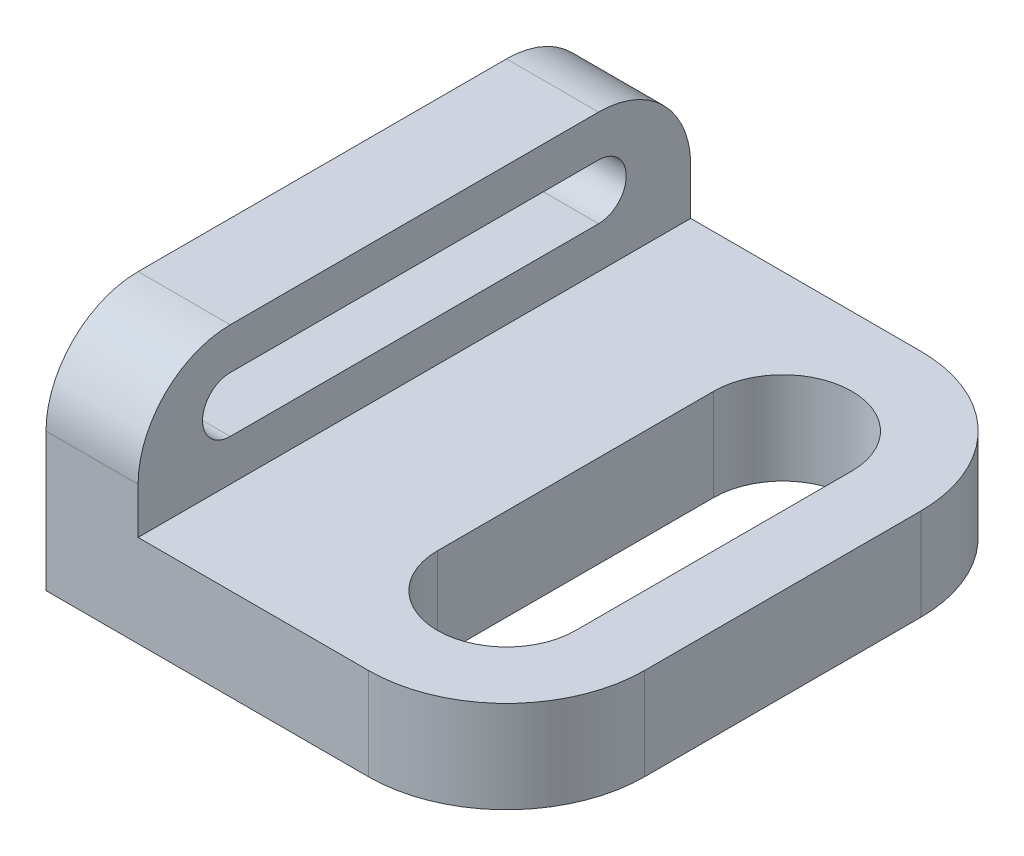
ISO-10303-21;
HEADER;
FILE_DESCRIPTION(('STEP AP214'),'2;1');
FILE_NAME('part.step','',(''),(''),'','','');
FILE_SCHEMA(('AUTOMOTIVE_DESIGN { 1 0 10303 214 1 1 1 1 }'));
ENDSEC;
DATA;
#1=APPLICATION_CONTEXT('core data for automotive mechanical design processes');
#2=APPLICATION_PROTOCOL_DEFINITION('international standard','automotive_design',2000,#1);
#3=PRODUCT_CONTEXT('',#1,'mechanical');
#4=PRODUCT('Part','Part','',(#3));
#5=PRODUCT_RELATED_PRODUCT_CATEGORY('part','',(#4));
#6=PRODUCT_DEFINITION_FORMATION('','',#4);
#7=PRODUCT_DEFINITION_CONTEXT('part definition',#1,'design');
#8=PRODUCT_DEFINITION('design','',#6,#7);
#9=PRODUCT_DEFINITION_SHAPE('','',#8);
#10=(LENGTH_UNIT() NAMED_UNIT(*) SI_UNIT(.MILLI.,.METRE.));
#11=(NAMED_UNIT(*) PLANE_ANGLE_UNIT() SI_UNIT($,.RADIAN.));
#12=(NAMED_UNIT(*) SI_UNIT($,.STERADIAN.) SOLID_ANGLE_UNIT());
#13=UNCERTAINTY_MEASURE_WITH_UNIT(LENGTH_MEASURE(1.E-05),#10,'distance_accuracy_value','');
#14=(GEOMETRIC_REPRESENTATION_CONTEXT(3) GLOBAL_UNCERTAINTY_ASSIGNED_CONTEXT((#13)) GLOBAL_UNIT_ASSIGNED_CONTEXT((#10,
#11,#12)) REPRESENTATION_CONTEXT('',''));
#15=CARTESIAN_POINT('',(0.,0.,0.));
#16=DIRECTION('',(0.,0.,1.));
#17=DIRECTION('',(1.,0.,0.));
#18=AXIS2_PLACEMENT_3D('',#15,#16,#17);
#19=CARTESIAN_POINT('',(-50.,20.,-60.));
#20=DIRECTION('',(1.,0.,0.));
#21=DIRECTION('',(0.,0.,-1.));
#22=AXIS2_PLACEMENT_3D('',#19,#20,#21);
#23=PLANE('',#22);
#24=DIRECTION('',(0.,0.,1.));
#25=VECTOR('',#24,1.);
#26=CARTESIAN_POINT('',(-50.,41.,40.));
#27=LINE('',#26,#25);
#28=CARTESIAN_POINT('',(-50.,41.,-40.));
#29=VERTEX_POINT('',#28);
#30=CARTESIAN_POINT('',(-50.,41.,40.));
#31=VERTEX_POINT('',#30);
#32=EDGE_CURVE('E385',#29,#31,#27,.T.);
#33=ORIENTED_EDGE('',*,*,#32,.T.);
#34=CARTESIAN_POINT('',(-50.,35.,40.));
#35=DIRECTION('',(1.,0.,0.));
#36=DIRECTION('',(0.,0.,-1.));
#37=AXIS2_PLACEMENT_3D('',#34,#35,#36);
#38=CIRCLE('',#37,6.);
#39=CARTESIAN_POINT('',(-50.,29.,40.));
#40=VERTEX_POINT('',#39);
#41=EDGE_CURVE('E389',#40,#31,#38,.F.);
#42=ORIENTED_EDGE('',*,*,#41,.F.);
#43=DIRECTION('',(0.,0.,1.));
#44=VECTOR('',#43,1.);
#45=CARTESIAN_POINT('',(-50.,29.,40.));
#46=LINE('',#45,#44);
#47=CARTESIAN_POINT('',(-50.,29.,-40.));
#48=VERTEX_POINT('',#47);
#49=EDGE_CURVE('E392',#48,#40,#46,.T.);
#50=ORIENTED_EDGE('',*,*,#49,.F.);
#51=CARTESIAN_POINT('',(-50.,35.,-40.));
#52=DIRECTION('',(1.,0.,0.));
#53=DIRECTION('',(0.,0.,-1.));
#54=AXIS2_PLACEMENT_3D('',#51,#52,#53);
#55=CIRCLE('',#54,6.);
#56=EDGE_CURVE('E381',#29,#48,#55,.F.);
#57=ORIENTED_EDGE('',*,*,#56,.F.);
#58=EDGE_LOOP('',(#33,#42,#50,#57));
#59=FACE_BOUND('',#58,.T.);
#60=CARTESIAN_POINT('',(-50.,30.,-40.));
#61=DIRECTION('',(1.,0.,0.));
#62=DIRECTION('',(0.,0.,-1.));
#63=AXIS2_PLACEMENT_3D('',#60,#61,#62);
#64=CIRCLE('',#63,20.);
#65=CARTESIAN_POINT('',(-50.,50.,-39.9999999999999));
#66=VERTEX_POINT('',#65);
#67=CARTESIAN_POINT('',(-50.,29.9999999999999,-60.));
#68=VERTEX_POINT('',#67);
#69=EDGE_CURVE('E210',#66,#68,#64,.F.);
#70=ORIENTED_EDGE('',*,*,#69,.T.);
#71=DIRECTION('',(0.,-1.,0.));
#72=VECTOR('',#71,1.);
#73=CARTESIAN_POINT('',(-50.,20.,-60.));
#74=LINE('',#73,#72);
#75=CARTESIAN_POINT('',(-50.,0.,-60.));
#76=VERTEX_POINT('',#75);
#77=EDGE_CURVE('E223',#68,#76,#74,.T.);
#78=ORIENTED_EDGE('',*,*,#77,.T.);
#79=DIRECTION('',(0.,0.,1.));
#80=VECTOR('',#79,1.);
#81=CARTESIAN_POINT('',(-50.,0.,-60.));
#82=LINE('',#81,#80);
#83=CARTESIAN_POINT('',(-50.,0.,60.));
#84=VERTEX_POINT('',#83);
#85=EDGE_CURVE('E281',#76,#84,#82,.T.);
#86=ORIENTED_EDGE('',*,*,#85,.T.);
#87=DIRECTION('',(0.,-1.,0.));
#88=VECTOR('',#87,1.);
#89=CARTESIAN_POINT('',(-50.,20.,60.));
#90=LINE('',#89,#88);
#91=CARTESIAN_POINT('',(-50.,29.9999999999999,60.));
#92=VERTEX_POINT('',#91);
#93=EDGE_CURVE('E12',#92,#84,#90,.T.);
#94=ORIENTED_EDGE('',*,*,#93,.F.);
#95=CARTESIAN_POINT('',(-50.,30.,40.));
#96=DIRECTION('',(1.,0.,0.));
#97=DIRECTION('',(0.,0.,-1.));
#98=AXIS2_PLACEMENT_3D('',#95,#96,#97);
#99=CIRCLE('',#98,20.);
#100=CARTESIAN_POINT('',(-50.,50.,39.9999999999999));
#101=VERTEX_POINT('',#100);
#102=EDGE_CURVE('E362',#92,#101,#99,.F.);
#103=ORIENTED_EDGE('',*,*,#102,.T.);
#104=DIRECTION('',(0.,0.,1.));
#105=VECTOR('',#104,1.);
#106=CARTESIAN_POINT('',(-50.,50.,60.));
#107=LINE('',#106,#105);
#108=EDGE_CURVE('E227',#66,#101,#107,.T.);
#109=ORIENTED_EDGE('',*,*,#108,.F.);
#110=EDGE_LOOP('',(#70,#78,#86,#94,#103,#109));
#111=FACE_BOUND('',#110,.T.);
#112=ADVANCED_FACE('F83',(#59,#111),#23,.F.);
#113=CARTESIAN_POINT('',(-50.,20.,60.));
#114=DIRECTION('',(0.,0.,-1.));
#115=DIRECTION('',(-1.,0.,0.));
#116=AXIS2_PLACEMENT_3D('',#113,#114,#115);
#117=PLANE('',#116);
#118=DIRECTION('',(1.,0.,0.));
#119=VECTOR('',#118,1.);
#120=CARTESIAN_POINT('',(-142.779308037946,29.9999999999999,60.));
#121=LINE('',#120,#119);
#122=CARTESIAN_POINT('',(-30.,29.9999999999999,60.));
#123=VERTEX_POINT('',#122);
#124=EDGE_CURVE('E368',#92,#123,#121,.T.);
#125=ORIENTED_EDGE('',*,*,#124,.F.);
#126=ORIENTED_EDGE('',*,*,#93,.T.);
#127=DIRECTION('',(1.,0.,0.));
#128=VECTOR('',#127,1.);
#129=CARTESIAN_POINT('',(-50.,0.,60.));
#130=LINE('',#129,#128);
#131=CARTESIAN_POINT('',(19.9999999999998,0.,60.));
#132=VERTEX_POINT('',#131);
#133=EDGE_CURVE('E272',#84,#132,#130,.T.);
#134=ORIENTED_EDGE('',*,*,#133,.T.);
#135=DIRECTION('',(0.,-1.,0.));
#136=VECTOR('',#135,1.);
#137=CARTESIAN_POINT('',(19.9999999999998,20.,60.));
#138=LINE('',#137,#136);
#139=CARTESIAN_POINT('',(19.9999999999998,20.,60.));
#140=VERTEX_POINT('',#139);
#141=EDGE_CURVE('E91',#140,#132,#138,.T.);
#142=ORIENTED_EDGE('',*,*,#141,.F.);
#143=DIRECTION('',(1.,0.,0.));
#144=VECTOR('',#143,1.);
#145=CARTESIAN_POINT('',(-50.,20.,60.));
#146=LINE('',#145,#144);
#147=CARTESIAN_POINT('',(-30.,20.,60.));
#148=VERTEX_POINT('',#147);
#149=EDGE_CURVE('E288',#148,#140,#146,.T.);
#150=ORIENTED_EDGE('',*,*,#149,.F.);
#151=DIRECTION('',(0.,-1.,0.));
#152=VECTOR('',#151,1.);
#153=CARTESIAN_POINT('',(-30.,50.,60.));
#154=LINE('',#153,#152);
#155=EDGE_CURVE('E340',#123,#148,#154,.T.);
#156=ORIENTED_EDGE('',*,*,#155,.F.);
#157=EDGE_LOOP('',(#125,#126,#134,#142,#150,#156));
#158=FACE_BOUND('',#157,.T.);
#159=ADVANCED_FACE('F429',(#158),#117,.F.);
#160=CARTESIAN_POINT('',(-30.,50.,60.));
#161=DIRECTION('',(-1.,0.,0.));
#162=DIRECTION('',(0.,0.,1.));
#163=AXIS2_PLACEMENT_3D('',#160,#161,#162);
#164=PLANE('',#163);
#165=DIRECTION('',(0.,0.,-1.));
#166=VECTOR('',#165,1.);
#167=CARTESIAN_POINT('',(-30.,29.,40.));
#168=LINE('',#167,#166);
#169=CARTESIAN_POINT('',(-30.,29.,40.));
#170=VERTEX_POINT('',#169);
#171=CARTESIAN_POINT('',(-30.,29.,-40.));
#172=VERTEX_POINT('',#171);
#173=EDGE_CURVE('E395',#170,#172,#168,.T.);
#174=ORIENTED_EDGE('',*,*,#173,.F.);
#175=CARTESIAN_POINT('',(-30.,35.,40.));
#176=DIRECTION('',(1.,0.,0.));
#177=DIRECTION('',(0.,0.,-1.));
#178=AXIS2_PLACEMENT_3D('',#175,#176,#177);
#179=CIRCLE('',#178,6.);
#180=CARTESIAN_POINT('',(-30.,41.,40.));
#181=VERTEX_POINT('',#180);
#182=EDGE_CURVE('E106',#181,#170,#179,.T.);
#183=ORIENTED_EDGE('',*,*,#182,.F.);
#184=DIRECTION('',(0.,0.,-1.));
#185=VECTOR('',#184,1.);
#186=CARTESIAN_POINT('',(-30.,41.,40.));
#187=LINE('',#186,#185);
#188=CARTESIAN_POINT('',(-30.,41.,-40.));
#189=VERTEX_POINT('',#188);
#190=EDGE_CURVE('E402',#181,#189,#187,.T.);
#191=ORIENTED_EDGE('',*,*,#190,.T.);
#192=CARTESIAN_POINT('',(-30.,35.,-40.));
#193=DIRECTION('',(1.,0.,0.));
#194=DIRECTION('',(0.,0.,-1.));
#195=AXIS2_PLACEMENT_3D('',#192,#193,#194);
#196=CIRCLE('',#195,6.);
#197=EDGE_CURVE('E398',#172,#189,#196,.T.);
#198=ORIENTED_EDGE('',*,*,#197,.F.);
#199=EDGE_LOOP('',(#174,#183,#191,#198));
#200=FACE_BOUND('',#199,.T.);
#201=CARTESIAN_POINT('',(-30.,30.,-40.));
#202=DIRECTION('',(1.,0.,0.));
#203=DIRECTION('',(0.,0.,-1.));
#204=AXIS2_PLACEMENT_3D('',#201,#202,#203);
#205=CIRCLE('',#204,20.);
#206=CARTESIAN_POINT('',(-30.,29.9999999999999,-60.));
#207=VERTEX_POINT('',#206);
#208=CARTESIAN_POINT('',(-30.,50.,-39.9999999999999));
#209=VERTEX_POINT('',#208);
#210=EDGE_CURVE('E213',#207,#209,#205,.T.);
#211=ORIENTED_EDGE('',*,*,#210,.T.);
#212=DIRECTION('',(0.,0.,-1.));
#213=VECTOR('',#212,1.);
#214=CARTESIAN_POINT('',(-30.,50.,60.));
#215=LINE('',#214,#213);
#216=CARTESIAN_POINT('',(-30.,50.,39.9999999999999));
#217=VERTEX_POINT('',#216);
#218=EDGE_CURVE('E357',#217,#209,#215,.T.);
#219=ORIENTED_EDGE('',*,*,#218,.F.);
#220=CARTESIAN_POINT('',(-30.,30.,40.));
#221=DIRECTION('',(1.,0.,0.));
#222=DIRECTION('',(0.,0.,-1.));
#223=AXIS2_PLACEMENT_3D('',#220,#221,#222);
#224=CIRCLE('',#223,20.);
#225=EDGE_CURVE('E375',#217,#123,#224,.T.);
#226=ORIENTED_EDGE('',*,*,#225,.T.);
#227=ORIENTED_EDGE('',*,*,#155,.T.);
#228=DIRECTION('',(0.,0.,-1.));
#229=VECTOR('',#228,1.);
#230=CARTESIAN_POINT('',(-30.,20.,60.));
#231=LINE('',#230,#229);
#232=CARTESIAN_POINT('',(-30.,20.,-60.));
#233=VERTEX_POINT('',#232);
#234=EDGE_CURVE('E358',#148,#233,#231,.T.);
#235=ORIENTED_EDGE('',*,*,#234,.T.);
#236=DIRECTION('',(0.,-1.,0.));
#237=VECTOR('',#236,1.);
#238=CARTESIAN_POINT('',(-30.,50.,-60.));
#239=LINE('',#238,#237);
#240=EDGE_CURVE('E354',#207,#233,#239,.T.);
#241=ORIENTED_EDGE('',*,*,#240,.F.);
#242=EDGE_LOOP('',(#211,#219,#226,#227,#235,#241));
#243=FACE_BOUND('',#242,.T.);
#244=ADVANCED_FACE('F424',(#200,#243),#164,.F.);
#245=CARTESIAN_POINT('',(0.,50.,0.));
#246=DIRECTION('',(0.,1.,0.));
#247=DIRECTION('',(0.,0.,1.));
#248=AXIS2_PLACEMENT_3D('',#245,#246,#247);
#249=PLANE('',#248);
#250=DIRECTION('',(1.,0.,0.));
#251=VECTOR('',#250,1.);
#252=CARTESIAN_POINT('',(-142.779308037946,50.,-39.9999999999999));
#253=LINE('',#252,#251);
#254=EDGE_CURVE('E218',#66,#209,#253,.T.);
#255=ORIENTED_EDGE('',*,*,#254,.F.);
#256=ORIENTED_EDGE('',*,*,#108,.T.);
#257=DIRECTION('',(1.,0.,0.));
#258=VECTOR('',#257,1.);
#259=CARTESIAN_POINT('',(-142.779308037946,50.,39.9999999999999));
#260=LINE('',#259,#258);
#261=EDGE_CURVE('E371',#101,#217,#260,.T.);
#262=ORIENTED_EDGE('',*,*,#261,.T.);
#263=ORIENTED_EDGE('',*,*,#218,.T.);
#264=EDGE_LOOP('',(#255,#256,#262,#263));
#265=FACE_BOUND('',#264,.T.);
#266=ADVANCED_FACE('F425',(#265),#249,.T.);
#267=CARTESIAN_POINT('',(20.,20.,30.));
#268=DIRECTION('',(0.,-1.,0.));
#269=DIRECTION('',(0.,0.,-1.));
#270=AXIS2_PLACEMENT_3D('',#267,#268,#269);
#271=PLANE('',#270);
#272=CARTESIAN_POINT('',(20.,20.,-30.));
#273=DIRECTION('',(0.,1.,0.));
#274=DIRECTION('',(0.,0.,1.));
#275=AXIS2_PLACEMENT_3D('',#272,#273,#274);
#276=CIRCLE('',#275,15.);
#277=CARTESIAN_POINT('',(35.,20.,-30.));
#278=VERTEX_POINT('',#277);
#279=CARTESIAN_POINT('',(5.00000000000002,20.,-30.));
#280=VERTEX_POINT('',#279);
#281=EDGE_CURVE('E328',#278,#280,#276,.T.);
#282=ORIENTED_EDGE('',*,*,#281,.F.);
#283=DIRECTION('',(0.,0.,-1.));
#284=VECTOR('',#283,1.);
#285=CARTESIAN_POINT('',(35.,20.,-30.));
#286=LINE('',#285,#284);
#287=CARTESIAN_POINT('',(35.,20.,30.));
#288=VERTEX_POINT('',#287);
#289=EDGE_CURVE('E323',#288,#278,#286,.T.);
#290=ORIENTED_EDGE('',*,*,#289,.F.);
#291=CARTESIAN_POINT('',(20.,20.,30.));
#292=DIRECTION('',(0.,1.,0.));
#293=DIRECTION('',(0.,0.,1.));
#294=AXIS2_PLACEMENT_3D('',#291,#292,#293);
#295=CIRCLE('',#294,15.);
#296=CARTESIAN_POINT('',(5.00000000000002,20.,30.));
#297=VERTEX_POINT('',#296);
#298=EDGE_CURVE('E343',#297,#288,#295,.T.);
#299=ORIENTED_EDGE('',*,*,#298,.F.);
#300=DIRECTION('',(0.,0.,1.));
#301=VECTOR('',#300,1.);
#302=CARTESIAN_POINT('',(5.00000000000002,20.,-30.));
#303=LINE('',#302,#301);
#304=EDGE_CURVE('E347',#280,#297,#303,.T.);
#305=ORIENTED_EDGE('',*,*,#304,.F.);
#306=EDGE_LOOP('',(#282,#290,#299,#305));
#307=FACE_BOUND('',#306,.T.);
#308=ORIENTED_EDGE('',*,*,#234,.F.);
#309=ORIENTED_EDGE('',*,*,#149,.T.);
#310=CARTESIAN_POINT('',(20.,20.,30.));
#311=DIRECTION('',(0.,1.,0.));
#312=DIRECTION('',(0.,0.,-1.));
#313=AXIS2_PLACEMENT_3D('',#310,#311,#312);
#314=CIRCLE('',#313,30.);
#315=CARTESIAN_POINT('',(50.,20.,29.9999999999998));
#316=VERTEX_POINT('',#315);
#317=EDGE_CURVE('E264',#140,#316,#314,.T.);
#318=ORIENTED_EDGE('',*,*,#317,.T.);
#319=DIRECTION('',(0.,0.,-1.));
#320=VECTOR('',#319,1.);
#321=CARTESIAN_POINT('',(50.,20.,-29.9999999999998));
#322=LINE('',#321,#320);
#323=CARTESIAN_POINT('',(50.,20.,-29.9999999999998));
#324=VERTEX_POINT('',#323);
#325=EDGE_CURVE('E294',#316,#324,#322,.T.);
#326=ORIENTED_EDGE('',*,*,#325,.T.);
#327=CARTESIAN_POINT('',(20.,20.,-30.));
#328=DIRECTION('',(0.,1.,0.));
#329=DIRECTION('',(0.,0.,1.));
#330=AXIS2_PLACEMENT_3D('',#327,#328,#329);
#331=CIRCLE('',#330,30.);
#332=CARTESIAN_POINT('',(19.9999999999998,20.,-60.));
#333=VERTEX_POINT('',#332);
#334=EDGE_CURVE('E244',#324,#333,#331,.T.);
#335=ORIENTED_EDGE('',*,*,#334,.T.);
#336=DIRECTION('',(-1.,0.,0.));
#337=VECTOR('',#336,1.);
#338=CARTESIAN_POINT('',(-50.,20.,-60.));
#339=LINE('',#338,#337);
#340=EDGE_CURVE('E237',#333,#233,#339,.T.);
#341=ORIENTED_EDGE('',*,*,#340,.T.);
#342=EDGE_LOOP('',(#308,#309,#318,#326,#335,#341));
#343=FACE_BOUND('',#342,.T.);
#344=ADVANCED_FACE('F431',(#307,#343),#271,.F.);
#345=CARTESIAN_POINT('',(20.,0.,30.));
#346=DIRECTION('',(0.,-1.,0.));
#347=DIRECTION('',(0.,0.,-1.));
#348=AXIS2_PLACEMENT_3D('',#345,#346,#347);
#349=PLANE('',#348);
#350=ORIENTED_EDGE('',*,*,#85,.F.);
#351=DIRECTION('',(-1.,0.,0.));
#352=VECTOR('',#351,1.);
#353=CARTESIAN_POINT('',(-50.,0.,-60.));
#354=LINE('',#353,#352);
#355=CARTESIAN_POINT('',(19.9999999999998,0.,-60.));
#356=VERTEX_POINT('',#355);
#357=EDGE_CURVE('E233',#356,#76,#354,.T.);
#358=ORIENTED_EDGE('',*,*,#357,.F.);
#359=CARTESIAN_POINT('',(20.,0.,-30.));
#360=DIRECTION('',(0.,1.,0.));
#361=DIRECTION('',(0.,0.,1.));
#362=AXIS2_PLACEMENT_3D('',#359,#360,#361);
#363=CIRCLE('',#362,30.);
#364=CARTESIAN_POINT('',(50.,0.,-29.9999999999998));
#365=VERTEX_POINT('',#364);
#366=EDGE_CURVE('E279',#365,#356,#363,.T.);
#367=ORIENTED_EDGE('',*,*,#366,.F.);
#368=DIRECTION('',(0.,0.,-1.));
#369=VECTOR('',#368,1.);
#370=CARTESIAN_POINT('',(50.,0.,-29.9999999999998));
#371=LINE('',#370,#369);
#372=CARTESIAN_POINT('',(50.,0.,29.9999999999998));
#373=VERTEX_POINT('',#372);
#374=EDGE_CURVE('E274',#373,#365,#371,.T.);
#375=ORIENTED_EDGE('',*,*,#374,.F.);
#376=CARTESIAN_POINT('',(20.,0.,30.));
#377=DIRECTION('',(0.,1.,0.));
#378=DIRECTION('',(0.,0.,-1.));
#379=AXIS2_PLACEMENT_3D('',#376,#377,#378);
#380=CIRCLE('',#379,30.);
#381=EDGE_CURVE('E263',#132,#373,#380,.T.);
#382=ORIENTED_EDGE('',*,*,#381,.F.);
#383=ORIENTED_EDGE('',*,*,#133,.F.);
#384=EDGE_LOOP('',(#350,#358,#367,#375,#382,#383));
#385=FACE_BOUND('',#384,.T.);
#386=DIRECTION('',(0.,0.,-1.));
#387=VECTOR('',#386,1.);
#388=CARTESIAN_POINT('',(35.,0.,-30.));
#389=LINE('',#388,#387);
#390=CARTESIAN_POINT('',(35.,0.,30.));
#391=VERTEX_POINT('',#390);
#392=CARTESIAN_POINT('',(35.,0.,-30.));
#393=VERTEX_POINT('',#392);
#394=EDGE_CURVE('E324',#391,#393,#389,.T.);
#395=ORIENTED_EDGE('',*,*,#394,.T.);
#396=CARTESIAN_POINT('',(20.,0.,-30.));
#397=DIRECTION('',(0.,1.,0.));
#398=DIRECTION('',(0.,0.,1.));
#399=AXIS2_PLACEMENT_3D('',#396,#397,#398);
#400=CIRCLE('',#399,15.);
#401=CARTESIAN_POINT('',(5.00000000000002,0.,-30.));
#402=VERTEX_POINT('',#401);
#403=EDGE_CURVE('E337',#393,#402,#400,.T.);
#404=ORIENTED_EDGE('',*,*,#403,.T.);
#405=DIRECTION('',(0.,0.,1.));
#406=VECTOR('',#405,1.);
#407=CARTESIAN_POINT('',(5.00000000000002,0.,-30.));
#408=LINE('',#407,#406);
#409=CARTESIAN_POINT('',(5.00000000000002,0.,30.));
#410=VERTEX_POINT('',#409);
#411=EDGE_CURVE('E333',#402,#410,#408,.T.);
#412=ORIENTED_EDGE('',*,*,#411,.T.);
#413=CARTESIAN_POINT('',(20.,0.,30.));
#414=DIRECTION('',(0.,1.,0.));
#415=DIRECTION('',(0.,0.,1.));
#416=AXIS2_PLACEMENT_3D('',#413,#414,#415);
#417=CIRCLE('',#416,15.);
#418=EDGE_CURVE('E329',#410,#391,#417,.T.);
#419=ORIENTED_EDGE('',*,*,#418,.T.);
#420=EDGE_LOOP('',(#395,#404,#412,#419));
#421=FACE_BOUND('',#420,.T.);
#422=ADVANCED_FACE('F270',(#385,#421),#349,.T.);
#423=CARTESIAN_POINT('',(20.,20.,30.));
#424=DIRECTION('',(0.,-1.,0.));
#425=DIRECTION('',(0.,0.,-1.));
#426=AXIS2_PLACEMENT_3D('',#423,#424,#425);
#427=CYLINDRICAL_SURFACE('',#426,30.);
#428=ORIENTED_EDGE('',*,*,#381,.T.);
#429=DIRECTION('',(0.,-1.,0.));
#430=VECTOR('',#429,1.);
#431=CARTESIAN_POINT('',(50.,20.,29.9999999999998));
#432=LINE('',#431,#430);
#433=EDGE_CURVE('E252',#316,#373,#432,.T.);
#434=ORIENTED_EDGE('',*,*,#433,.F.);
#435=ORIENTED_EDGE('',*,*,#317,.F.);
#436=ORIENTED_EDGE('',*,*,#141,.T.);
#437=EDGE_LOOP('',(#428,#434,#435,#436));
#438=FACE_BOUND('',#437,.T.);
#439=ADVANCED_FACE('F261',(#438),#427,.T.);
#440=CARTESIAN_POINT('',(50.,20.,-29.9999999999998));
#441=DIRECTION('',(-1.,0.,0.));
#442=DIRECTION('',(0.,0.,1.));
#443=AXIS2_PLACEMENT_3D('',#440,#441,#442);
#444=PLANE('',#443);
#445=ORIENTED_EDGE('',*,*,#374,.T.);
#446=DIRECTION('',(0.,-1.,0.));
#447=VECTOR('',#446,1.);
#448=CARTESIAN_POINT('',(50.,20.,-29.9999999999998));
#449=LINE('',#448,#447);
#450=EDGE_CURVE('E241',#324,#365,#449,.T.);
#451=ORIENTED_EDGE('',*,*,#450,.F.);
#452=ORIENTED_EDGE('',*,*,#325,.F.);
#453=ORIENTED_EDGE('',*,*,#433,.T.);
#454=EDGE_LOOP('',(#445,#451,#452,#453));
#455=FACE_BOUND('',#454,.T.);
#456=ADVANCED_FACE('F438',(#455),#444,.F.);
#457=CARTESIAN_POINT('',(20.,20.,-30.));
#458=DIRECTION('',(0.,-1.,0.));
#459=DIRECTION('',(0.,0.,-1.));
#460=AXIS2_PLACEMENT_3D('',#457,#458,#459);
#461=CYLINDRICAL_SURFACE('',#460,30.);
#462=ORIENTED_EDGE('',*,*,#366,.T.);
#463=DIRECTION('',(0.,-1.,0.));
#464=VECTOR('',#463,1.);
#465=CARTESIAN_POINT('',(19.9999999999998,20.,-60.));
#466=LINE('',#465,#464);
#467=EDGE_CURVE('E236',#333,#356,#466,.T.);
#468=ORIENTED_EDGE('',*,*,#467,.F.);
#469=ORIENTED_EDGE('',*,*,#334,.F.);
#470=ORIENTED_EDGE('',*,*,#450,.T.);
#471=EDGE_LOOP('',(#462,#468,#469,#470));
#472=FACE_BOUND('',#471,.T.);
#473=ADVANCED_FACE('F434',(#472),#461,.T.);
#474=CARTESIAN_POINT('',(-50.,20.,-60.));
#475=DIRECTION('',(0.,0.,1.));
#476=DIRECTION('',(1.,0.,0.));
#477=AXIS2_PLACEMENT_3D('',#474,#475,#476);
#478=PLANE('',#477);
#479=ORIENTED_EDGE('',*,*,#77,.F.);
#480=DIRECTION('',(1.,0.,0.));
#481=VECTOR('',#480,1.);
#482=CARTESIAN_POINT('',(-142.779308037946,29.9999999999999,-60.));
#483=LINE('',#482,#481);
#484=EDGE_CURVE('E207',#68,#207,#483,.T.);
#485=ORIENTED_EDGE('',*,*,#484,.T.);
#486=ORIENTED_EDGE('',*,*,#240,.T.);
#487=ORIENTED_EDGE('',*,*,#340,.F.);
#488=ORIENTED_EDGE('',*,*,#467,.T.);
#489=ORIENTED_EDGE('',*,*,#357,.T.);
#490=EDGE_LOOP('',(#479,#485,#486,#487,#488,#489));
#491=FACE_BOUND('',#490,.T.);
#492=ADVANCED_FACE('F230',(#491),#478,.F.);
#493=CARTESIAN_POINT('',(20.,20.,-30.));
#494=DIRECTION('',(0.,-1.,0.));
#495=DIRECTION('',(0.,0.,-1.));
#496=AXIS2_PLACEMENT_3D('',#493,#494,#495);
#497=CYLINDRICAL_SURFACE('',#496,15.);
#498=ORIENTED_EDGE('',*,*,#403,.F.);
#499=DIRECTION('',(0.,-1.,0.));
#500=VECTOR('',#499,1.);
#501=CARTESIAN_POINT('',(35.,20.,-30.));
#502=LINE('',#501,#500);
#503=EDGE_CURVE('E317',#278,#393,#502,.T.);
#504=ORIENTED_EDGE('',*,*,#503,.F.);
#505=ORIENTED_EDGE('',*,*,#281,.T.);
#506=DIRECTION('',(0.,-1.,0.));
#507=VECTOR('',#506,1.);
#508=CARTESIAN_POINT('',(5.00000000000002,20.,-30.));
#509=LINE('',#508,#507);
#510=EDGE_CURVE('E297',#280,#402,#509,.T.);
#511=ORIENTED_EDGE('',*,*,#510,.T.);
#512=EDGE_LOOP('',(#498,#504,#505,#511));
#513=FACE_BOUND('',#512,.T.);
#514=ADVANCED_FACE('F497',(#513),#497,.F.);
#515=CARTESIAN_POINT('',(5.00000000000002,20.,-30.));
#516=DIRECTION('',(1.,0.,0.));
#517=DIRECTION('',(0.,0.,-1.));
#518=AXIS2_PLACEMENT_3D('',#515,#516,#517);
#519=PLANE('',#518);
#520=ORIENTED_EDGE('',*,*,#411,.F.);
#521=ORIENTED_EDGE('',*,*,#510,.F.);
#522=ORIENTED_EDGE('',*,*,#304,.T.);
#523=DIRECTION('',(0.,-1.,0.));
#524=VECTOR('',#523,1.);
#525=CARTESIAN_POINT('',(5.00000000000002,20.,30.));
#526=LINE('',#525,#524);
#527=EDGE_CURVE('E307',#297,#410,#526,.T.);
#528=ORIENTED_EDGE('',*,*,#527,.T.);
#529=EDGE_LOOP('',(#520,#521,#522,#528));
#530=FACE_BOUND('',#529,.T.);
#531=ADVANCED_FACE('F493',(#530),#519,.T.);
#532=CARTESIAN_POINT('',(20.,20.,30.));
#533=DIRECTION('',(0.,-1.,0.));
#534=DIRECTION('',(0.,0.,-1.));
#535=AXIS2_PLACEMENT_3D('',#532,#533,#534);
#536=CYLINDRICAL_SURFACE('',#535,15.);
#537=ORIENTED_EDGE('',*,*,#418,.F.);
#538=ORIENTED_EDGE('',*,*,#527,.F.);
#539=ORIENTED_EDGE('',*,*,#298,.T.);
#540=DIRECTION('',(0.,-1.,0.));
#541=VECTOR('',#540,1.);
#542=CARTESIAN_POINT('',(35.,20.,30.));
#543=LINE('',#542,#541);
#544=EDGE_CURVE('E312',#288,#391,#543,.T.);
#545=ORIENTED_EDGE('',*,*,#544,.T.);
#546=EDGE_LOOP('',(#537,#538,#539,#545));
#547=FACE_BOUND('',#546,.T.);
#548=ADVANCED_FACE('F489',(#547),#536,.F.);
#549=CARTESIAN_POINT('',(35.,20.,-30.));
#550=DIRECTION('',(-1.,0.,0.));
#551=DIRECTION('',(0.,0.,1.));
#552=AXIS2_PLACEMENT_3D('',#549,#550,#551);
#553=PLANE('',#552);
#554=ORIENTED_EDGE('',*,*,#394,.F.);
#555=ORIENTED_EDGE('',*,*,#544,.F.);
#556=ORIENTED_EDGE('',*,*,#289,.T.);
#557=ORIENTED_EDGE('',*,*,#503,.T.);
#558=EDGE_LOOP('',(#554,#555,#556,#557));
#559=FACE_BOUND('',#558,.T.);
#560=ADVANCED_FACE('F482',(#559),#553,.T.);
#561=CARTESIAN_POINT('',(-142.779308037946,30.,40.));
#562=DIRECTION('',(1.,0.,0.));
#563=DIRECTION('',(0.,0.,-1.));
#564=AXIS2_PLACEMENT_3D('',#561,#562,#563);
#565=CYLINDRICAL_SURFACE('',#564,20.);
#566=ORIENTED_EDGE('',*,*,#124,.T.);
#567=ORIENTED_EDGE('',*,*,#225,.F.);
#568=ORIENTED_EDGE('',*,*,#261,.F.);
#569=ORIENTED_EDGE('',*,*,#102,.F.);
#570=EDGE_LOOP('',(#566,#567,#568,#569));
#571=FACE_BOUND('',#570,.T.);
#572=ADVANCED_FACE('F427',(#571),#565,.T.);
#573=CARTESIAN_POINT('',(-142.779308037946,30.,-40.));
#574=DIRECTION('',(1.,0.,0.));
#575=DIRECTION('',(0.,0.,-1.));
#576=AXIS2_PLACEMENT_3D('',#573,#574,#575);
#577=CYLINDRICAL_SURFACE('',#576,20.);
#578=ORIENTED_EDGE('',*,*,#254,.T.);
#579=ORIENTED_EDGE('',*,*,#210,.F.);
#580=ORIENTED_EDGE('',*,*,#484,.F.);
#581=ORIENTED_EDGE('',*,*,#69,.F.);
#582=EDGE_LOOP('',(#578,#579,#580,#581));
#583=FACE_BOUND('',#582,.T.);
#584=ADVANCED_FACE('F209',(#583),#577,.T.);
#585=CARTESIAN_POINT('',(-142.779308037946,35.,40.));
#586=DIRECTION('',(1.,0.,0.));
#587=DIRECTION('',(0.,0.,-1.));
#588=AXIS2_PLACEMENT_3D('',#585,#586,#587);
#589=CYLINDRICAL_SURFACE('',#588,6.);
#590=ORIENTED_EDGE('',*,*,#41,.T.);
#591=DIRECTION('',(1.,0.,0.));
#592=VECTOR('',#591,1.);
#593=CARTESIAN_POINT('',(-142.779308037946,41.,40.));
#594=LINE('',#593,#592);
#595=EDGE_CURVE('E384',#31,#181,#594,.T.);
#596=ORIENTED_EDGE('',*,*,#595,.T.);
#597=ORIENTED_EDGE('',*,*,#182,.T.);
#598=DIRECTION('',(1.,0.,0.));
#599=VECTOR('',#598,1.);
#600=CARTESIAN_POINT('',(-142.779308037946,29.,40.));
#601=LINE('',#600,#599);
#602=EDGE_CURVE('E406',#40,#170,#601,.T.);
#603=ORIENTED_EDGE('',*,*,#602,.F.);
#604=EDGE_LOOP('',(#590,#596,#597,#603));
#605=FACE_BOUND('',#604,.T.);
#606=ADVANCED_FACE('F466',(#605),#589,.F.);
#607=CARTESIAN_POINT('',(-142.779308037946,41.,40.));
#608=DIRECTION('',(0.,-1.,0.));
#609=DIRECTION('',(0.,0.,-1.));
#610=AXIS2_PLACEMENT_3D('',#607,#608,#609);
#611=PLANE('',#610);
#612=DIRECTION('',(1.,0.,0.));
#613=VECTOR('',#612,1.);
#614=CARTESIAN_POINT('',(-142.779308037946,41.,-40.));
#615=LINE('',#614,#613);
#616=EDGE_CURVE('E409',#29,#189,#615,.T.);
#617=ORIENTED_EDGE('',*,*,#616,.T.);
#618=ORIENTED_EDGE('',*,*,#190,.F.);
#619=ORIENTED_EDGE('',*,*,#595,.F.);
#620=ORIENTED_EDGE('',*,*,#32,.F.);
#621=EDGE_LOOP('',(#617,#618,#619,#620));
#622=FACE_BOUND('',#621,.T.);
#623=ADVANCED_FACE('F458',(#622),#611,.T.);
#624=CARTESIAN_POINT('',(-142.779308037946,35.,-40.));
#625=DIRECTION('',(1.,0.,0.));
#626=DIRECTION('',(0.,0.,-1.));
#627=AXIS2_PLACEMENT_3D('',#624,#625,#626);
#628=CYLINDRICAL_SURFACE('',#627,6.);
#629=ORIENTED_EDGE('',*,*,#56,.T.);
#630=DIRECTION('',(1.,0.,0.));
#631=VECTOR('',#630,1.);
#632=CARTESIAN_POINT('',(-142.779308037946,29.,-40.));
#633=LINE('',#632,#631);
#634=EDGE_CURVE('E98',#48,#172,#633,.T.);
#635=ORIENTED_EDGE('',*,*,#634,.T.);
#636=ORIENTED_EDGE('',*,*,#197,.T.);
#637=ORIENTED_EDGE('',*,*,#616,.F.);
#638=EDGE_LOOP('',(#629,#635,#636,#637));
#639=FACE_BOUND('',#638,.T.);
#640=ADVANCED_FACE('F461',(#639),#628,.F.);
#641=CARTESIAN_POINT('',(-142.779308037946,29.,40.));
#642=DIRECTION('',(0.,-1.,0.));
#643=DIRECTION('',(0.,0.,-1.));
#644=AXIS2_PLACEMENT_3D('',#641,#642,#643);
#645=PLANE('',#644);
#646=ORIENTED_EDGE('',*,*,#49,.T.);
#647=ORIENTED_EDGE('',*,*,#602,.T.);
#648=ORIENTED_EDGE('',*,*,#173,.T.);
#649=ORIENTED_EDGE('',*,*,#634,.F.);
#650=EDGE_LOOP('',(#646,#647,#648,#649));
#651=FACE_BOUND('',#650,.T.);
#652=ADVANCED_FACE('F465',(#651),#645,.F.);
#653=CLOSED_SHELL('',(#112,#159,#244,#266,#344,#422,#439,#456,#473,#492,#514,#531,#548,#560,
#572,#584,#606,#623,#640,#652));
#654=MANIFOLD_SOLID_BREP('B2',#653);
#655=ADVANCED_BREP_SHAPE_REPRESENTATION('',(#18,#654),#14);
#656=SHAPE_DEFINITION_REPRESENTATION(#9,#655);
ENDSEC;
END-ISO-10303-21;
